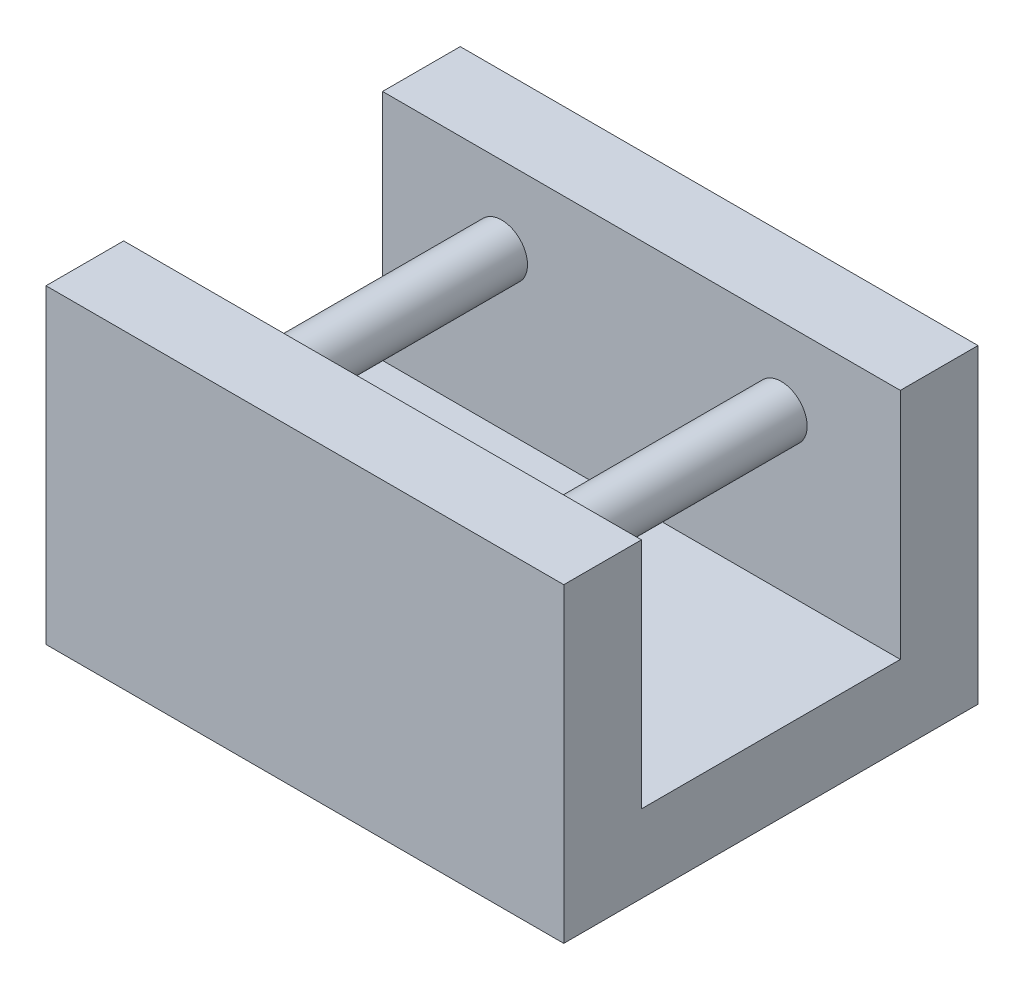
ISO-10303-21;
HEADER;
FILE_DESCRIPTION(('STEP AP214'),'2;1');
FILE_NAME('part.step','',(''),(''),'','','');
FILE_SCHEMA(('AUTOMOTIVE_DESIGN { 1 0 10303 214 1 1 1 1 }'));
ENDSEC;
DATA;
#1=APPLICATION_CONTEXT('core data for automotive mechanical design processes');
#2=APPLICATION_PROTOCOL_DEFINITION('international standard','automotive_design',2000,#1);
#3=PRODUCT_CONTEXT('',#1,'mechanical');
#4=PRODUCT('Part','Part','',(#3));
#5=PRODUCT_RELATED_PRODUCT_CATEGORY('part','',(#4));
#6=PRODUCT_DEFINITION_FORMATION('','',#4);
#7=PRODUCT_DEFINITION_CONTEXT('part definition',#1,'design');
#8=PRODUCT_DEFINITION('design','',#6,#7);
#9=PRODUCT_DEFINITION_SHAPE('','',#8);
#10=(LENGTH_UNIT() NAMED_UNIT(*) SI_UNIT(.MILLI.,.METRE.));
#11=(NAMED_UNIT(*) PLANE_ANGLE_UNIT() SI_UNIT($,.RADIAN.));
#12=(NAMED_UNIT(*) SI_UNIT($,.STERADIAN.) SOLID_ANGLE_UNIT());
#13=UNCERTAINTY_MEASURE_WITH_UNIT(LENGTH_MEASURE(1.E-05),#10,'distance_accuracy_value','');
#14=(GEOMETRIC_REPRESENTATION_CONTEXT(3) GLOBAL_UNCERTAINTY_ASSIGNED_CONTEXT((#13)) GLOBAL_UNIT_ASSIGNED_CONTEXT((#10,
#11,#12)) REPRESENTATION_CONTEXT('',''));
#15=CARTESIAN_POINT('',(0.,0.,0.));
#16=DIRECTION('',(0.,0.,1.));
#17=DIRECTION('',(1.,0.,0.));
#18=AXIS2_PLACEMENT_3D('',#15,#16,#17);
#19=CARTESIAN_POINT('',(100.,0.,-80.));
#20=DIRECTION('',(0.,1.,0.));
#21=DIRECTION('',(0.,0.,1.));
#22=AXIS2_PLACEMENT_3D('',#19,#20,#21);
#23=PLANE('',#22);
#24=DIRECTION('',(0.,0.,-1.));
#25=VECTOR('',#24,1.);
#26=CARTESIAN_POINT('',(0.,0.,-80.));
#27=LINE('',#26,#25);
#28=CARTESIAN_POINT('',(0.,0.,0.));
#29=VERTEX_POINT('',#28);
#30=CARTESIAN_POINT('',(0.,0.,-80.));
#31=VERTEX_POINT('',#30);
#32=EDGE_CURVE('E138',#29,#31,#27,.T.);
#33=ORIENTED_EDGE('',*,*,#32,.T.);
#34=DIRECTION('',(-1.,0.,0.));
#35=VECTOR('',#34,1.);
#36=CARTESIAN_POINT('',(100.,0.,-80.));
#37=LINE('',#36,#35);
#38=CARTESIAN_POINT('',(100.,0.,-80.));
#39=VERTEX_POINT('',#38);
#40=EDGE_CURVE('E165',#39,#31,#37,.T.);
#41=ORIENTED_EDGE('',*,*,#40,.F.);
#42=DIRECTION('',(0.,0.,-1.));
#43=VECTOR('',#42,1.);
#44=CARTESIAN_POINT('',(100.,0.,-80.));
#45=LINE('',#44,#43);
#46=CARTESIAN_POINT('',(100.,0.,0.));
#47=VERTEX_POINT('',#46);
#48=EDGE_CURVE('E152',#47,#39,#45,.T.);
#49=ORIENTED_EDGE('',*,*,#48,.F.);
#50=DIRECTION('',(-1.,0.,0.));
#51=VECTOR('',#50,1.);
#52=CARTESIAN_POINT('',(100.,0.,0.));
#53=LINE('',#52,#51);
#54=EDGE_CURVE('E134',#47,#29,#53,.T.);
#55=ORIENTED_EDGE('',*,*,#54,.T.);
#56=EDGE_LOOP('',(#33,#41,#49,#55));
#57=FACE_BOUND('',#56,.T.);
#58=ADVANCED_FACE('F41',(#57),#23,.F.);
#59=CARTESIAN_POINT('',(100.,60.,-80.));
#60=DIRECTION('',(0.,0.,1.));
#61=DIRECTION('',(0.,-1.,0.));
#62=AXIS2_PLACEMENT_3D('',#59,#60,#61);
#63=PLANE('',#62);
#64=DIRECTION('',(0.,1.,0.));
#65=VECTOR('',#64,1.);
#66=CARTESIAN_POINT('',(0.,60.,-80.));
#67=LINE('',#66,#65);
#68=CARTESIAN_POINT('',(0.,60.,-80.));
#69=VERTEX_POINT('',#68);
#70=EDGE_CURVE('E141',#31,#69,#67,.T.);
#71=ORIENTED_EDGE('',*,*,#70,.T.);
#72=DIRECTION('',(-1.,0.,0.));
#73=VECTOR('',#72,1.);
#74=CARTESIAN_POINT('',(100.,60.,-80.));
#75=LINE('',#74,#73);
#76=CARTESIAN_POINT('',(100.,60.,-80.));
#77=VERTEX_POINT('',#76);
#78=EDGE_CURVE('E162',#77,#69,#75,.T.);
#79=ORIENTED_EDGE('',*,*,#78,.F.);
#80=DIRECTION('',(0.,1.,0.));
#81=VECTOR('',#80,1.);
#82=CARTESIAN_POINT('',(100.,60.,-80.));
#83=LINE('',#82,#81);
#84=EDGE_CURVE('E101',#39,#77,#83,.T.);
#85=ORIENTED_EDGE('',*,*,#84,.F.);
#86=ORIENTED_EDGE('',*,*,#40,.T.);
#87=EDGE_LOOP('',(#71,#79,#85,#86));
#88=FACE_BOUND('',#87,.T.);
#89=ADVANCED_FACE('F220',(#88),#63,.F.);
#90=CARTESIAN_POINT('',(100.,60.,-65.));
#91=DIRECTION('',(0.,-1.,0.));
#92=DIRECTION('',(0.,0.,-1.));
#93=AXIS2_PLACEMENT_3D('',#90,#91,#92);
#94=PLANE('',#93);
#95=DIRECTION('',(0.,0.,1.));
#96=VECTOR('',#95,1.);
#97=CARTESIAN_POINT('',(0.,60.,-65.));
#98=LINE('',#97,#96);
#99=CARTESIAN_POINT('',(0.,60.,-65.));
#100=VERTEX_POINT('',#99);
#101=EDGE_CURVE('E143',#69,#100,#98,.T.);
#102=ORIENTED_EDGE('',*,*,#101,.T.);
#103=DIRECTION('',(-1.,0.,0.));
#104=VECTOR('',#103,1.);
#105=CARTESIAN_POINT('',(100.,60.,-65.));
#106=LINE('',#105,#104);
#107=CARTESIAN_POINT('',(100.,60.,-65.));
#108=VERTEX_POINT('',#107);
#109=EDGE_CURVE('E159',#108,#100,#106,.T.);
#110=ORIENTED_EDGE('',*,*,#109,.F.);
#111=DIRECTION('',(0.,0.,1.));
#112=VECTOR('',#111,1.);
#113=CARTESIAN_POINT('',(100.,60.,-65.));
#114=LINE('',#113,#112);
#115=EDGE_CURVE('E318',#77,#108,#114,.T.);
#116=ORIENTED_EDGE('',*,*,#115,.F.);
#117=ORIENTED_EDGE('',*,*,#78,.T.);
#118=EDGE_LOOP('',(#102,#110,#116,#117));
#119=FACE_BOUND('',#118,.T.);
#120=ADVANCED_FACE('F194',(#119),#94,.F.);
#121=CARTESIAN_POINT('',(100.,15.,-65.));
#122=DIRECTION('',(0.,0.,-1.));
#123=DIRECTION('',(-1.,0.,0.));
#124=AXIS2_PLACEMENT_3D('',#121,#122,#123);
#125=PLANE('',#124);
#126=CARTESIAN_POINT('',(23.,45.,-65.));
#127=DIRECTION('',(0.,0.,-1.));
#128=DIRECTION('',(-1.,0.,0.));
#129=AXIS2_PLACEMENT_3D('',#126,#127,#128);
#130=CIRCLE('',#129,5.);
#131=CARTESIAN_POINT('',(23.,40.,-65.));
#132=VERTEX_POINT('',#131);
#133=EDGE_CURVE('E11',#132,#132,#130,.F.);
#134=ORIENTED_EDGE('',*,*,#133,.F.);
#135=EDGE_LOOP('',(#134));
#136=FACE_BOUND('',#135,.T.);
#137=CARTESIAN_POINT('',(77.,45.,-65.));
#138=DIRECTION('',(0.,0.,-1.));
#139=DIRECTION('',(-1.,0.,0.));
#140=AXIS2_PLACEMENT_3D('',#137,#138,#139);
#141=CIRCLE('',#140,5.00000000000001);
#142=CARTESIAN_POINT('',(77.,40.,-65.));
#143=VERTEX_POINT('',#142);
#144=EDGE_CURVE('E170',#143,#143,#141,.F.);
#145=ORIENTED_EDGE('',*,*,#144,.F.);
#146=EDGE_LOOP('',(#145));
#147=FACE_BOUND('',#146,.T.);
#148=DIRECTION('',(0.,-1.,0.));
#149=VECTOR('',#148,1.);
#150=CARTESIAN_POINT('',(0.,15.,-65.));
#151=LINE('',#150,#149);
#152=CARTESIAN_POINT('',(0.,15.,-65.));
#153=VERTEX_POINT('',#152);
#154=EDGE_CURVE('E145',#100,#153,#151,.T.);
#155=ORIENTED_EDGE('',*,*,#154,.T.);
#156=DIRECTION('',(-1.,0.,0.));
#157=VECTOR('',#156,1.);
#158=CARTESIAN_POINT('',(100.,15.,-65.));
#159=LINE('',#158,#157);
#160=CARTESIAN_POINT('',(100.,15.,-65.));
#161=VERTEX_POINT('',#160);
#162=EDGE_CURVE('E156',#161,#153,#159,.T.);
#163=ORIENTED_EDGE('',*,*,#162,.F.);
#164=DIRECTION('',(0.,-1.,0.));
#165=VECTOR('',#164,1.);
#166=CARTESIAN_POINT('',(100.,15.,-65.));
#167=LINE('',#166,#165);
#168=EDGE_CURVE('E319',#108,#161,#167,.T.);
#169=ORIENTED_EDGE('',*,*,#168,.F.);
#170=ORIENTED_EDGE('',*,*,#109,.T.);
#171=EDGE_LOOP('',(#155,#163,#169,#170));
#172=FACE_BOUND('',#171,.T.);
#173=ADVANCED_FACE('F191',(#136,#147,#172),#125,.F.);
#174=CARTESIAN_POINT('',(100.,15.,-15.));
#175=DIRECTION('',(0.,-1.,0.));
#176=DIRECTION('',(0.,0.,-1.));
#177=AXIS2_PLACEMENT_3D('',#174,#175,#176);
#178=PLANE('',#177);
#179=DIRECTION('',(0.,0.,1.));
#180=VECTOR('',#179,1.);
#181=CARTESIAN_POINT('',(0.,15.,-15.));
#182=LINE('',#181,#180);
#183=CARTESIAN_POINT('',(0.,15.,-15.));
#184=VERTEX_POINT('',#183);
#185=EDGE_CURVE('E147',#153,#184,#182,.T.);
#186=ORIENTED_EDGE('',*,*,#185,.T.);
#187=DIRECTION('',(-1.,0.,0.));
#188=VECTOR('',#187,1.);
#189=CARTESIAN_POINT('',(100.,15.,-15.));
#190=LINE('',#189,#188);
#191=CARTESIAN_POINT('',(100.,15.,-15.));
#192=VERTEX_POINT('',#191);
#193=EDGE_CURVE('E129',#192,#184,#190,.T.);
#194=ORIENTED_EDGE('',*,*,#193,.F.);
#195=DIRECTION('',(0.,0.,1.));
#196=VECTOR('',#195,1.);
#197=CARTESIAN_POINT('',(100.,15.,-15.));
#198=LINE('',#197,#196);
#199=EDGE_CURVE('E120',#161,#192,#198,.T.);
#200=ORIENTED_EDGE('',*,*,#199,.F.);
#201=ORIENTED_EDGE('',*,*,#162,.T.);
#202=EDGE_LOOP('',(#186,#194,#200,#201));
#203=FACE_BOUND('',#202,.T.);
#204=ADVANCED_FACE('F180',(#203),#178,.F.);
#205=CARTESIAN_POINT('',(100.,60.,-15.));
#206=DIRECTION('',(0.,0.,1.));
#207=DIRECTION('',(0.,-1.,0.));
#208=AXIS2_PLACEMENT_3D('',#205,#206,#207);
#209=PLANE('',#208);
#210=CARTESIAN_POINT('',(23.,45.,-15.));
#211=DIRECTION('',(0.,0.,1.));
#212=DIRECTION('',(0.,-1.,0.));
#213=AXIS2_PLACEMENT_3D('',#210,#211,#212);
#214=CIRCLE('',#213,5.);
#215=CARTESIAN_POINT('',(23.,40.,-15.));
#216=VERTEX_POINT('',#215);
#217=EDGE_CURVE('E49',#216,#216,#214,.F.);
#218=ORIENTED_EDGE('',*,*,#217,.F.);
#219=EDGE_LOOP('',(#218));
#220=FACE_BOUND('',#219,.T.);
#221=CARTESIAN_POINT('',(77.,45.,-15.));
#222=DIRECTION('',(0.,0.,1.));
#223=DIRECTION('',(0.,-1.,0.));
#224=AXIS2_PLACEMENT_3D('',#221,#222,#223);
#225=CIRCLE('',#224,5.00000000000001);
#226=CARTESIAN_POINT('',(77.,40.,-15.));
#227=VERTEX_POINT('',#226);
#228=EDGE_CURVE('E167',#227,#227,#225,.F.);
#229=ORIENTED_EDGE('',*,*,#228,.F.);
#230=EDGE_LOOP('',(#229));
#231=FACE_BOUND('',#230,.T.);
#232=DIRECTION('',(0.,1.,0.));
#233=VECTOR('',#232,1.);
#234=CARTESIAN_POINT('',(0.,60.,-15.));
#235=LINE('',#234,#233);
#236=CARTESIAN_POINT('',(0.,60.,-15.));
#237=VERTEX_POINT('',#236);
#238=EDGE_CURVE('E128',#184,#237,#235,.T.);
#239=ORIENTED_EDGE('',*,*,#238,.T.);
#240=DIRECTION('',(-1.,0.,0.));
#241=VECTOR('',#240,1.);
#242=CARTESIAN_POINT('',(100.,60.,-15.));
#243=LINE('',#242,#241);
#244=CARTESIAN_POINT('',(100.,60.,-15.));
#245=VERTEX_POINT('',#244);
#246=EDGE_CURVE('E125',#245,#237,#243,.T.);
#247=ORIENTED_EDGE('',*,*,#246,.F.);
#248=DIRECTION('',(0.,1.,0.));
#249=VECTOR('',#248,1.);
#250=CARTESIAN_POINT('',(100.,60.,-15.));
#251=LINE('',#250,#249);
#252=EDGE_CURVE('E114',#192,#245,#251,.T.);
#253=ORIENTED_EDGE('',*,*,#252,.F.);
#254=ORIENTED_EDGE('',*,*,#193,.T.);
#255=EDGE_LOOP('',(#239,#247,#253,#254));
#256=FACE_BOUND('',#255,.T.);
#257=ADVANCED_FACE('F126',(#220,#231,#256),#209,.F.);
#258=CARTESIAN_POINT('',(100.,60.,0.));
#259=DIRECTION('',(0.,-1.,0.));
#260=DIRECTION('',(0.,0.,-1.));
#261=AXIS2_PLACEMENT_3D('',#258,#259,#260);
#262=PLANE('',#261);
#263=DIRECTION('',(0.,0.,1.));
#264=VECTOR('',#263,1.);
#265=CARTESIAN_POINT('',(0.,60.,0.));
#266=LINE('',#265,#264);
#267=CARTESIAN_POINT('',(0.,60.,0.));
#268=VERTEX_POINT('',#267);
#269=EDGE_CURVE('E86',#237,#268,#266,.T.);
#270=ORIENTED_EDGE('',*,*,#269,.T.);
#271=DIRECTION('',(-1.,0.,0.));
#272=VECTOR('',#271,1.);
#273=CARTESIAN_POINT('',(100.,60.,0.));
#274=LINE('',#273,#272);
#275=CARTESIAN_POINT('',(100.,60.,0.));
#276=VERTEX_POINT('',#275);
#277=EDGE_CURVE('E130',#276,#268,#274,.T.);
#278=ORIENTED_EDGE('',*,*,#277,.F.);
#279=DIRECTION('',(0.,0.,1.));
#280=VECTOR('',#279,1.);
#281=CARTESIAN_POINT('',(100.,60.,0.));
#282=LINE('',#281,#280);
#283=EDGE_CURVE('E118',#245,#276,#282,.T.);
#284=ORIENTED_EDGE('',*,*,#283,.F.);
#285=ORIENTED_EDGE('',*,*,#246,.T.);
#286=EDGE_LOOP('',(#270,#278,#284,#285));
#287=FACE_BOUND('',#286,.T.);
#288=ADVANCED_FACE('F132',(#287),#262,.F.);
#289=CARTESIAN_POINT('',(100.,0.,0.));
#290=DIRECTION('',(0.,0.,-1.));
#291=DIRECTION('',(-1.,0.,0.));
#292=AXIS2_PLACEMENT_3D('',#289,#290,#291);
#293=PLANE('',#292);
#294=DIRECTION('',(0.,-1.,0.));
#295=VECTOR('',#294,1.);
#296=CARTESIAN_POINT('',(0.,0.,0.));
#297=LINE('',#296,#295);
#298=EDGE_CURVE('E92',#268,#29,#297,.T.);
#299=ORIENTED_EDGE('',*,*,#298,.T.);
#300=ORIENTED_EDGE('',*,*,#54,.F.);
#301=DIRECTION('',(0.,-1.,0.));
#302=VECTOR('',#301,1.);
#303=CARTESIAN_POINT('',(100.,0.,0.));
#304=LINE('',#303,#302);
#305=EDGE_CURVE('E57',#276,#47,#304,.T.);
#306=ORIENTED_EDGE('',*,*,#305,.F.);
#307=ORIENTED_EDGE('',*,*,#277,.T.);
#308=EDGE_LOOP('',(#299,#300,#306,#307));
#309=FACE_BOUND('',#308,.T.);
#310=ADVANCED_FACE('F209',(#309),#293,.F.);
#311=CARTESIAN_POINT('',(100.,0.,0.));
#312=DIRECTION('',(-1.,0.,0.));
#313=DIRECTION('',(0.,0.,1.));
#314=AXIS2_PLACEMENT_3D('',#311,#312,#313);
#315=PLANE('',#314);
#316=ORIENTED_EDGE('',*,*,#48,.T.);
#317=ORIENTED_EDGE('',*,*,#84,.T.);
#318=ORIENTED_EDGE('',*,*,#115,.T.);
#319=ORIENTED_EDGE('',*,*,#168,.T.);
#320=ORIENTED_EDGE('',*,*,#199,.T.);
#321=ORIENTED_EDGE('',*,*,#252,.T.);
#322=ORIENTED_EDGE('',*,*,#283,.T.);
#323=ORIENTED_EDGE('',*,*,#305,.T.);
#324=EDGE_LOOP('',(#316,#317,#318,#319,#320,#321,#322,#323));
#325=FACE_BOUND('',#324,.T.);
#326=ADVANCED_FACE('F116',(#325),#315,.F.);
#327=CARTESIAN_POINT('',(0.,0.,0.));
#328=DIRECTION('',(-1.,0.,0.));
#329=DIRECTION('',(0.,0.,1.));
#330=AXIS2_PLACEMENT_3D('',#327,#328,#329);
#331=PLANE('',#330);
#332=ORIENTED_EDGE('',*,*,#32,.F.);
#333=ORIENTED_EDGE('',*,*,#298,.F.);
#334=ORIENTED_EDGE('',*,*,#269,.F.);
#335=ORIENTED_EDGE('',*,*,#238,.F.);
#336=ORIENTED_EDGE('',*,*,#185,.F.);
#337=ORIENTED_EDGE('',*,*,#154,.F.);
#338=ORIENTED_EDGE('',*,*,#101,.F.);
#339=ORIENTED_EDGE('',*,*,#70,.F.);
#340=EDGE_LOOP('',(#332,#333,#334,#335,#336,#337,#338,#339));
#341=FACE_BOUND('',#340,.T.);
#342=ADVANCED_FACE('F187',(#341),#331,.T.);
#343=CARTESIAN_POINT('',(77.,45.,-79.142135623731));
#344=DIRECTION('',(0.,0.,1.));
#345=DIRECTION('',(0.,-1.,0.));
#346=AXIS2_PLACEMENT_3D('',#343,#344,#345);
#347=CYLINDRICAL_SURFACE('',#346,5.00000000000001);
#348=CARTESIAN_POINT('',(77.,40.,-15.));
#349=CARTESIAN_POINT('',(77.,40.,-15.5208333333333));
#350=CARTESIAN_POINT('',(77.,40.,-16.0416666666667));
#351=CARTESIAN_POINT('',(77.,40.,-17.0833333333333));
#352=CARTESIAN_POINT('',(77.,40.,-17.6041666666667));
#353=CARTESIAN_POINT('',(77.,40.,-18.6458333333333));
#354=CARTESIAN_POINT('',(77.,40.,-19.1666666666667));
#355=CARTESIAN_POINT('',(77.,40.,-20.2083333333333));
#356=CARTESIAN_POINT('',(77.,40.,-20.7291666666667));
#357=CARTESIAN_POINT('',(77.,40.,-21.7708333333333));
#358=CARTESIAN_POINT('',(77.,40.,-22.2916666666667));
#359=CARTESIAN_POINT('',(77.,40.,-23.3333333333333));
#360=CARTESIAN_POINT('',(77.,40.,-23.8541666666667));
#361=CARTESIAN_POINT('',(77.,40.,-24.8958333333333));
#362=CARTESIAN_POINT('',(77.,40.,-25.4166666666667));
#363=CARTESIAN_POINT('',(77.,40.,-26.4583333333333));
#364=CARTESIAN_POINT('',(77.,40.,-26.9791666666667));
#365=CARTESIAN_POINT('',(77.,40.,-28.0208333333333));
#366=CARTESIAN_POINT('',(77.,40.,-28.5416666666667));
#367=CARTESIAN_POINT('',(77.,40.,-29.5833333333333));
#368=CARTESIAN_POINT('',(77.,40.,-30.1041666666667));
#369=CARTESIAN_POINT('',(77.,40.,-31.1458333333333));
#370=CARTESIAN_POINT('',(77.,40.,-31.6666666666667));
#371=CARTESIAN_POINT('',(77.,40.,-32.7083333333333));
#372=CARTESIAN_POINT('',(77.,40.,-33.2291666666667));
#373=CARTESIAN_POINT('',(77.,40.,-34.2708333333333));
#374=CARTESIAN_POINT('',(77.,40.,-34.7916666666667));
#375=CARTESIAN_POINT('',(77.,40.,-35.8333333333333));
#376=CARTESIAN_POINT('',(77.,40.,-36.3541666666667));
#377=CARTESIAN_POINT('',(77.,40.,-37.3958333333333));
#378=CARTESIAN_POINT('',(77.,40.,-37.9166666666667));
#379=CARTESIAN_POINT('',(77.,40.,-38.9583333333333));
#380=CARTESIAN_POINT('',(77.,40.,-39.4791666666667));
#381=CARTESIAN_POINT('',(77.,40.,-40.5208333333333));
#382=CARTESIAN_POINT('',(77.,40.,-41.0416666666667));
#383=CARTESIAN_POINT('',(77.,40.,-42.0833333333333));
#384=CARTESIAN_POINT('',(77.,40.,-42.6041666666667));
#385=CARTESIAN_POINT('',(77.,40.,-43.6458333333333));
#386=CARTESIAN_POINT('',(77.,40.,-44.1666666666667));
#387=CARTESIAN_POINT('',(77.,40.,-45.2083333333333));
#388=CARTESIAN_POINT('',(77.,40.,-45.7291666666667));
#389=CARTESIAN_POINT('',(77.,40.,-46.7708333333333));
#390=CARTESIAN_POINT('',(77.,40.,-47.2916666666667));
#391=CARTESIAN_POINT('',(77.,40.,-48.3333333333333));
#392=CARTESIAN_POINT('',(77.,40.,-48.8541666666667));
#393=CARTESIAN_POINT('',(77.,40.,-49.8958333333333));
#394=CARTESIAN_POINT('',(77.,40.,-50.4166666666667));
#395=CARTESIAN_POINT('',(77.,40.,-51.4583333333333));
#396=CARTESIAN_POINT('',(77.,40.,-51.9791666666667));
#397=CARTESIAN_POINT('',(77.,40.,-53.0208333333333));
#398=CARTESIAN_POINT('',(77.,40.,-53.5416666666667));
#399=CARTESIAN_POINT('',(77.,40.,-54.5833333333333));
#400=CARTESIAN_POINT('',(77.,40.,-55.1041666666667));
#401=CARTESIAN_POINT('',(77.,40.,-56.1458333333333));
#402=CARTESIAN_POINT('',(77.,40.,-56.6666666666667));
#403=CARTESIAN_POINT('',(77.,40.,-57.7083333333333));
#404=CARTESIAN_POINT('',(77.,40.,-58.2291666666667));
#405=CARTESIAN_POINT('',(77.,40.,-59.2708333333333));
#406=CARTESIAN_POINT('',(77.,40.,-59.7916666666667));
#407=CARTESIAN_POINT('',(77.,40.,-60.8333333333333));
#408=CARTESIAN_POINT('',(77.,40.,-61.3541666666667));
#409=CARTESIAN_POINT('',(77.,40.,-62.3958333333333));
#410=CARTESIAN_POINT('',(77.,40.,-62.9166666666667));
#411=CARTESIAN_POINT('',(77.,40.,-63.9583333333333));
#412=CARTESIAN_POINT('',(77.,40.,-64.4791666666667));
#413=CARTESIAN_POINT('',(77.,40.,-65.));
#414=B_SPLINE_CURVE_WITH_KNOTS('',3,(#348,#349,#350,#351,#352,#353,#354,#355,#356,#357,#358,
#359,#360,#361,#362,#363,#364,#365,#366,#367,#368,#369,#370,#371,#372,#373,#374,#375,#376,#377,
#378,#379,#380,#381,#382,#383,#384,#385,#386,#387,#388,#389,#390,#391,#392,#393,#394,#395,#396,
#397,#398,#399,#400,#401,#402,#403,#404,#405,#406,#407,#408,#409,#410,#411,#412,#413),
.UNSPECIFIED.,.F.,.F.,(4,2,2,2,2,2,2,2,2,2,2,2,2,2,2,2,2,2,2,2,2,2,2,2,2,2,2,2,2,2,2,2,4),(0.,
1.56249999999999,3.125,4.6875,6.25,7.8125,9.375,10.9375,12.5,14.0625,15.625,17.1875,18.75,
20.3125,21.875,23.4375,25.,26.5625,28.125,29.6875,31.25,32.8125,34.375,35.9375,37.5,39.0625,
40.625,42.1875,43.75,45.3125,46.875,48.4375,50.),.UNSPECIFIED.);
#415=EDGE_CURVE('BSEAM184',#227,#143,#414,.T.);
#416=ORIENTED_EDGE('',*,*,#228,.T.);
#417=ORIENTED_EDGE('',*,*,#144,.T.);
#418=ORIENTED_EDGE('',*,*,#415,.T.);
#419=ORIENTED_EDGE('',*,*,#415,.F.);
#420=EDGE_LOOP('',(#416,#418,#417,#419));
#421=FACE_BOUND('',#420,.T.);
#422=ADVANCED_FACE('F184',(#421),#347,.T.);
#423=CARTESIAN_POINT('',(23.,45.,-79.142135623731));
#424=DIRECTION('',(0.,0.,1.));
#425=DIRECTION('',(0.,-1.,0.));
#426=AXIS2_PLACEMENT_3D('',#423,#424,#425);
#427=CYLINDRICAL_SURFACE('',#426,5.);
#428=CARTESIAN_POINT('',(23.,40.,-15.));
#429=CARTESIAN_POINT('',(23.,40.,-15.5208333333333));
#430=CARTESIAN_POINT('',(23.,40.,-16.0416666666667));
#431=CARTESIAN_POINT('',(23.,40.,-17.0833333333333));
#432=CARTESIAN_POINT('',(23.,40.,-17.6041666666667));
#433=CARTESIAN_POINT('',(23.,40.,-18.6458333333333));
#434=CARTESIAN_POINT('',(23.,40.,-19.1666666666667));
#435=CARTESIAN_POINT('',(23.,40.,-20.2083333333333));
#436=CARTESIAN_POINT('',(23.,40.,-20.7291666666667));
#437=CARTESIAN_POINT('',(23.,40.,-21.7708333333333));
#438=CARTESIAN_POINT('',(23.,40.,-22.2916666666667));
#439=CARTESIAN_POINT('',(23.,40.,-23.3333333333333));
#440=CARTESIAN_POINT('',(23.,40.,-23.8541666666667));
#441=CARTESIAN_POINT('',(23.,40.,-24.8958333333333));
#442=CARTESIAN_POINT('',(23.,40.,-25.4166666666667));
#443=CARTESIAN_POINT('',(23.,40.,-26.4583333333333));
#444=CARTESIAN_POINT('',(23.,40.,-26.9791666666667));
#445=CARTESIAN_POINT('',(23.,40.,-28.0208333333333));
#446=CARTESIAN_POINT('',(23.,40.,-28.5416666666667));
#447=CARTESIAN_POINT('',(23.,40.,-29.5833333333333));
#448=CARTESIAN_POINT('',(23.,40.,-30.1041666666667));
#449=CARTESIAN_POINT('',(23.,40.,-31.1458333333333));
#450=CARTESIAN_POINT('',(23.,40.,-31.6666666666667));
#451=CARTESIAN_POINT('',(23.,40.,-32.7083333333333));
#452=CARTESIAN_POINT('',(23.,40.,-33.2291666666667));
#453=CARTESIAN_POINT('',(23.,40.,-34.2708333333333));
#454=CARTESIAN_POINT('',(23.,40.,-34.7916666666667));
#455=CARTESIAN_POINT('',(23.,40.,-35.8333333333333));
#456=CARTESIAN_POINT('',(23.,40.,-36.3541666666667));
#457=CARTESIAN_POINT('',(23.,40.,-37.3958333333333));
#458=CARTESIAN_POINT('',(23.,40.,-37.9166666666667));
#459=CARTESIAN_POINT('',(23.,40.,-38.9583333333333));
#460=CARTESIAN_POINT('',(23.,40.,-39.4791666666667));
#461=CARTESIAN_POINT('',(23.,40.,-40.5208333333333));
#462=CARTESIAN_POINT('',(23.,40.,-41.0416666666667));
#463=CARTESIAN_POINT('',(23.,40.,-42.0833333333333));
#464=CARTESIAN_POINT('',(23.,40.,-42.6041666666667));
#465=CARTESIAN_POINT('',(23.,40.,-43.6458333333333));
#466=CARTESIAN_POINT('',(23.,40.,-44.1666666666667));
#467=CARTESIAN_POINT('',(23.,40.,-45.2083333333333));
#468=CARTESIAN_POINT('',(23.,40.,-45.7291666666667));
#469=CARTESIAN_POINT('',(23.,40.,-46.7708333333333));
#470=CARTESIAN_POINT('',(23.,40.,-47.2916666666667));
#471=CARTESIAN_POINT('',(23.,40.,-48.3333333333333));
#472=CARTESIAN_POINT('',(23.,40.,-48.8541666666667));
#473=CARTESIAN_POINT('',(23.,40.,-49.8958333333333));
#474=CARTESIAN_POINT('',(23.,40.,-50.4166666666667));
#475=CARTESIAN_POINT('',(23.,40.,-51.4583333333333));
#476=CARTESIAN_POINT('',(23.,40.,-51.9791666666667));
#477=CARTESIAN_POINT('',(23.,40.,-53.0208333333333));
#478=CARTESIAN_POINT('',(23.,40.,-53.5416666666667));
#479=CARTESIAN_POINT('',(23.,40.,-54.5833333333333));
#480=CARTESIAN_POINT('',(23.,40.,-55.1041666666667));
#481=CARTESIAN_POINT('',(23.,40.,-56.1458333333333));
#482=CARTESIAN_POINT('',(23.,40.,-56.6666666666667));
#483=CARTESIAN_POINT('',(23.,40.,-57.7083333333333));
#484=CARTESIAN_POINT('',(23.,40.,-58.2291666666667));
#485=CARTESIAN_POINT('',(23.,40.,-59.2708333333333));
#486=CARTESIAN_POINT('',(23.,40.,-59.7916666666667));
#487=CARTESIAN_POINT('',(23.,40.,-60.8333333333333));
#488=CARTESIAN_POINT('',(23.,40.,-61.3541666666667));
#489=CARTESIAN_POINT('',(23.,40.,-62.3958333333333));
#490=CARTESIAN_POINT('',(23.,40.,-62.9166666666667));
#491=CARTESIAN_POINT('',(23.,40.,-63.9583333333333));
#492=CARTESIAN_POINT('',(23.,40.,-64.4791666666667));
#493=CARTESIAN_POINT('',(23.,40.,-65.));
#494=B_SPLINE_CURVE_WITH_KNOTS('',3,(#428,#429,#430,#431,#432,#433,#434,#435,#436,#437,#438,
#439,#440,#441,#442,#443,#444,#445,#446,#447,#448,#449,#450,#451,#452,#453,#454,#455,#456,#457,
#458,#459,#460,#461,#462,#463,#464,#465,#466,#467,#468,#469,#470,#471,#472,#473,#474,#475,#476,
#477,#478,#479,#480,#481,#482,#483,#484,#485,#486,#487,#488,#489,#490,#491,#492,#493),
.UNSPECIFIED.,.F.,.F.,(4,2,2,2,2,2,2,2,2,2,2,2,2,2,2,2,2,2,2,2,2,2,2,2,2,2,2,2,2,2,2,2,4),(0.,
1.56249999999999,3.125,4.6875,6.25,7.8125,9.375,10.9375,12.5,14.0625,15.625,17.1875,18.75,
20.3125,21.875,23.4375,25.,26.5625,28.125,29.6875,31.25,32.8125,34.375,35.9375,37.5,39.0625,
40.625,42.1875,43.75,45.3125,46.875,48.4375,50.),.UNSPECIFIED.);
#495=EDGE_CURVE('BSEAM175',#216,#132,#494,.T.);
#496=ORIENTED_EDGE('',*,*,#217,.T.);
#497=ORIENTED_EDGE('',*,*,#133,.T.);
#498=ORIENTED_EDGE('',*,*,#495,.T.);
#499=ORIENTED_EDGE('',*,*,#495,.F.);
#500=EDGE_LOOP('',(#496,#498,#497,#499));
#501=FACE_BOUND('',#500,.T.);
#502=ADVANCED_FACE('F175',(#501),#427,.T.);
#503=CLOSED_SHELL('',(#58,#89,#120,#173,#204,#257,#288,#310,#326,#342,#422,#502));
#504=MANIFOLD_SOLID_BREP('B2',#503);
#505=ADVANCED_BREP_SHAPE_REPRESENTATION('',(#18,#504),#14);
#506=SHAPE_DEFINITION_REPRESENTATION(#9,#505);
ENDSEC;
END-ISO-10303-21;
